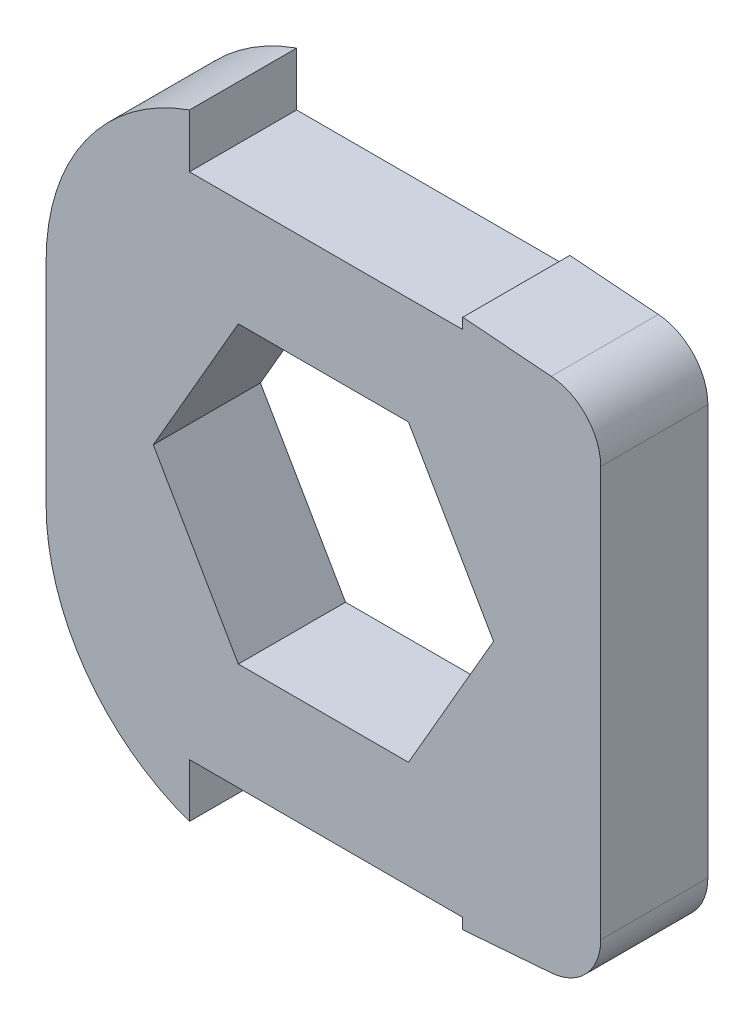
ISO-10303-21;
HEADER;
FILE_DESCRIPTION(('STEP AP214'),'2;1');
FILE_NAME('part.step','',(''),(''),'','','');
FILE_SCHEMA(('AUTOMOTIVE_DESIGN { 1 0 10303 214 1 1 1 1 }'));
ENDSEC;
DATA;
#1=APPLICATION_CONTEXT('core data for automotive mechanical design processes');
#2=APPLICATION_PROTOCOL_DEFINITION('international standard','automotive_design',2000,#1);
#3=PRODUCT_CONTEXT('',#1,'mechanical');
#4=PRODUCT('Part','Part','',(#3));
#5=PRODUCT_RELATED_PRODUCT_CATEGORY('part','',(#4));
#6=PRODUCT_DEFINITION_FORMATION('','',#4);
#7=PRODUCT_DEFINITION_CONTEXT('part definition',#1,'design');
#8=PRODUCT_DEFINITION('design','',#6,#7);
#9=PRODUCT_DEFINITION_SHAPE('','',#8);
#10=(LENGTH_UNIT() NAMED_UNIT(*) SI_UNIT(.MILLI.,.METRE.));
#11=(NAMED_UNIT(*) PLANE_ANGLE_UNIT() SI_UNIT($,.RADIAN.));
#12=(NAMED_UNIT(*) SI_UNIT($,.STERADIAN.) SOLID_ANGLE_UNIT());
#13=UNCERTAINTY_MEASURE_WITH_UNIT(LENGTH_MEASURE(1.E-05),#10,'distance_accuracy_value','');
#14=(GEOMETRIC_REPRESENTATION_CONTEXT(3) GLOBAL_UNCERTAINTY_ASSIGNED_CONTEXT((#13)) GLOBAL_UNIT_ASSIGNED_CONTEXT((#10,
#11,#12)) REPRESENTATION_CONTEXT('',''));
#15=CARTESIAN_POINT('',(0.,0.,0.));
#16=DIRECTION('',(0.,0.,1.));
#17=DIRECTION('',(1.,0.,0.));
#18=AXIS2_PLACEMENT_3D('',#15,#16,#17);
#19=CARTESIAN_POINT('',(0.,0.,2.));
#20=DIRECTION('',(0.,0.,-1.));
#21=DIRECTION('',(-1.,0.,0.));
#22=AXIS2_PLACEMENT_3D('',#19,#20,#21);
#23=PLANE('',#22);
#24=DIRECTION('',(0.996998261930065,0.0774239349841494,0.));
#25=VECTOR('',#24,1.);
#26=CARTESIAN_POINT('',(10.3508529610859,-4.75,2.));
#27=LINE('',#26,#25);
#28=CARTESIAN_POINT('',(7.77542648054295,-4.95,2.));
#29=VERTEX_POINT('',#28);
#30=CARTESIAN_POINT('',(9.42827689607004,-4.82164452738106,2.));
#31=VERTEX_POINT('',#30);
#32=EDGE_CURVE('E269',#29,#31,#27,.T.);
#33=ORIENTED_EDGE('',*,*,#32,.T.);
#34=CARTESIAN_POINT('',(9.35085296108589,-3.824646265451,2.));
#35=DIRECTION('',(0.,0.,-1.));
#36=DIRECTION('',(-1.,0.,0.));
#37=AXIS2_PLACEMENT_3D('',#34,#35,#36);
#38=CIRCLE('',#37,1.);
#39=CARTESIAN_POINT('',(10.3508529610859,-3.824646265451,2.));
#40=VERTEX_POINT('',#39);
#41=EDGE_CURVE('E48',#31,#40,#38,.F.);
#42=ORIENTED_EDGE('',*,*,#41,.T.);
#43=DIRECTION('',(0.,1.,0.));
#44=VECTOR('',#43,1.);
#45=CARTESIAN_POINT('',(10.3508529610859,4.75,2.));
#46=LINE('',#45,#44);
#47=CARTESIAN_POINT('',(10.3508529610859,3.824646265451,2.));
#48=VERTEX_POINT('',#47);
#49=EDGE_CURVE('E272',#40,#48,#46,.T.);
#50=ORIENTED_EDGE('',*,*,#49,.T.);
#51=CARTESIAN_POINT('',(9.35085296108589,3.824646265451,2.));
#52=DIRECTION('',(0.,0.,-1.));
#53=DIRECTION('',(-1.,0.,0.));
#54=AXIS2_PLACEMENT_3D('',#51,#52,#53);
#55=CIRCLE('',#54,1.);
#56=CARTESIAN_POINT('',(9.42827689607004,4.82164452738106,2.));
#57=VERTEX_POINT('',#56);
#58=EDGE_CURVE('E55',#48,#57,#55,.F.);
#59=ORIENTED_EDGE('',*,*,#58,.T.);
#60=DIRECTION('',(-0.996998261930065,0.0774239349841494,0.));
#61=VECTOR('',#60,1.);
#62=CARTESIAN_POINT('',(10.3508529610859,4.75,2.));
#63=LINE('',#62,#61);
#64=CARTESIAN_POINT('',(7.77542648054295,4.95,2.));
#65=VERTEX_POINT('',#64);
#66=EDGE_CURVE('E275',#57,#65,#63,.T.);
#67=ORIENTED_EDGE('',*,*,#66,.T.);
#68=DIRECTION('',(0.,-1.,0.));
#69=VECTOR('',#68,1.);
#70=CARTESIAN_POINT('',(7.77542648054295,4.95,2.));
#71=LINE('',#70,#69);
#72=CARTESIAN_POINT('',(7.77542648054295,4.75,2.));
#73=VERTEX_POINT('',#72);
#74=EDGE_CURVE('E278',#65,#73,#71,.T.);
#75=ORIENTED_EDGE('',*,*,#74,.T.);
#76=DIRECTION('',(-1.,0.,0.));
#77=VECTOR('',#76,1.);
#78=CARTESIAN_POINT('',(7.77542648054295,4.75,2.));
#79=LINE('',#78,#77);
#80=CARTESIAN_POINT('',(2.67542648054295,4.75,2.));
#81=VERTEX_POINT('',#80);
#82=EDGE_CURVE('E281',#73,#81,#79,.T.);
#83=ORIENTED_EDGE('',*,*,#82,.T.);
#84=DIRECTION('',(0.,1.,0.));
#85=VECTOR('',#84,1.);
#86=CARTESIAN_POINT('',(2.67542648054295,5.75,2.));
#87=LINE('',#86,#85);
#88=CARTESIAN_POINT('',(2.67542648054295,5.75,2.));
#89=VERTEX_POINT('',#88);
#90=EDGE_CURVE('E284',#81,#89,#87,.T.);
#91=ORIENTED_EDGE('',*,*,#90,.T.);
#92=CARTESIAN_POINT('',(4.,1.97567820773677,2.));
#93=DIRECTION('',(0.,0.,-1.));
#94=DIRECTION('',(-1.,0.,0.));
#95=AXIS2_PLACEMENT_3D('',#92,#93,#94);
#96=CIRCLE('',#95,4.);
#97=CARTESIAN_POINT('',(0.,1.97567820773677,2.));
#98=VERTEX_POINT('',#97);
#99=EDGE_CURVE('E363',#89,#98,#96,.F.);
#100=ORIENTED_EDGE('',*,*,#99,.T.);
#101=DIRECTION('',(0.,-1.,0.));
#102=VECTOR('',#101,1.);
#103=CARTESIAN_POINT('',(0.,-5.75,2.));
#104=LINE('',#103,#102);
#105=CARTESIAN_POINT('',(0.,-1.97567820773677,2.));
#106=VERTEX_POINT('',#105);
#107=EDGE_CURVE('E255',#98,#106,#104,.T.);
#108=ORIENTED_EDGE('',*,*,#107,.T.);
#109=CARTESIAN_POINT('',(4.,-1.97567820773677,2.));
#110=DIRECTION('',(0.,0.,-1.));
#111=DIRECTION('',(-1.,0.,0.));
#112=AXIS2_PLACEMENT_3D('',#109,#110,#111);
#113=CIRCLE('',#112,4.);
#114=CARTESIAN_POINT('',(2.67542648054295,-5.75,2.));
#115=VERTEX_POINT('',#114);
#116=EDGE_CURVE('E366',#106,#115,#113,.F.);
#117=ORIENTED_EDGE('',*,*,#116,.T.);
#118=DIRECTION('',(0.,1.,0.));
#119=VECTOR('',#118,1.);
#120=CARTESIAN_POINT('',(2.67542648054295,-4.75,2.));
#121=LINE('',#120,#119);
#122=CARTESIAN_POINT('',(2.67542648054295,-4.75,2.));
#123=VERTEX_POINT('',#122);
#124=EDGE_CURVE('E259',#115,#123,#121,.T.);
#125=ORIENTED_EDGE('',*,*,#124,.T.);
#126=DIRECTION('',(1.,0.,0.));
#127=VECTOR('',#126,1.);
#128=CARTESIAN_POINT('',(7.77542648054295,-4.75,2.));
#129=LINE('',#128,#127);
#130=CARTESIAN_POINT('',(7.77542648054295,-4.75,2.));
#131=VERTEX_POINT('',#130);
#132=EDGE_CURVE('E263',#123,#131,#129,.T.);
#133=ORIENTED_EDGE('',*,*,#132,.T.);
#134=DIRECTION('',(0.,-1.,0.));
#135=VECTOR('',#134,1.);
#136=CARTESIAN_POINT('',(7.77542648054295,-4.95,2.));
#137=LINE('',#136,#135);
#138=EDGE_CURVE('E266',#131,#29,#137,.T.);
#139=ORIENTED_EDGE('',*,*,#138,.T.);
#140=EDGE_LOOP('',(#33,#42,#50,#59,#67,#75,#83,#91,#100,#108,#117,#125,#133,#139));
#141=FACE_BOUND('',#140,.T.);
#142=DIRECTION('',(-0.5,-0.866025403784438,0.));
#143=VECTOR('',#142,1.);
#144=CARTESIAN_POINT('',(3.58771324027147,2.75,2.));
#145=LINE('',#144,#143);
#146=CARTESIAN_POINT('',(3.58771324027147,2.75,2.));
#147=VERTEX_POINT('',#146);
#148=CARTESIAN_POINT('',(2.,0.,2.));
#149=VERTEX_POINT('',#148);
#150=EDGE_CURVE('E181',#147,#149,#145,.T.);
#151=ORIENTED_EDGE('',*,*,#150,.F.);
#152=DIRECTION('',(-1.,0.,0.));
#153=VECTOR('',#152,1.);
#154=CARTESIAN_POINT('',(6.76313972081442,2.75,2.));
#155=LINE('',#154,#153);
#156=CARTESIAN_POINT('',(6.76313972081442,2.75,2.));
#157=VERTEX_POINT('',#156);
#158=EDGE_CURVE('E219',#157,#147,#155,.T.);
#159=ORIENTED_EDGE('',*,*,#158,.F.);
#160=DIRECTION('',(-0.5,0.866025403784438,0.));
#161=VECTOR('',#160,1.);
#162=CARTESIAN_POINT('',(8.35085296108589,0.,2.));
#163=LINE('',#162,#161);
#164=CARTESIAN_POINT('',(8.35085296108589,0.,2.));
#165=VERTEX_POINT('',#164);
#166=EDGE_CURVE('E215',#165,#157,#163,.T.);
#167=ORIENTED_EDGE('',*,*,#166,.F.);
#168=DIRECTION('',(0.5,0.866025403784439,0.));
#169=VECTOR('',#168,1.);
#170=CARTESIAN_POINT('',(6.76313972081442,-2.75,2.));
#171=LINE('',#170,#169);
#172=CARTESIAN_POINT('',(6.76313972081442,-2.75,2.));
#173=VERTEX_POINT('',#172);
#174=EDGE_CURVE('E210',#173,#165,#171,.T.);
#175=ORIENTED_EDGE('',*,*,#174,.F.);
#176=DIRECTION('',(1.,0.,0.));
#177=VECTOR('',#176,1.);
#178=CARTESIAN_POINT('',(3.58771324027147,-2.75,2.));
#179=LINE('',#178,#177);
#180=CARTESIAN_POINT('',(3.58771324027147,-2.75,2.));
#181=VERTEX_POINT('',#180);
#182=EDGE_CURVE('E206',#181,#173,#179,.T.);
#183=ORIENTED_EDGE('',*,*,#182,.F.);
#184=DIRECTION('',(0.500000000000002,-0.866025403784438,0.));
#185=VECTOR('',#184,1.);
#186=CARTESIAN_POINT('',(2.,0.,2.));
#187=LINE('',#186,#185);
#188=EDGE_CURVE('E192',#149,#181,#187,.T.);
#189=ORIENTED_EDGE('',*,*,#188,.F.);
#190=EDGE_LOOP('',(#151,#159,#167,#175,#183,#189));
#191=FACE_BOUND('',#190,.T.);
#192=ADVANCED_FACE('F39',(#141,#191),#23,.F.);
#193=CARTESIAN_POINT('',(0.,0.,0.));
#194=DIRECTION('',(0.,0.,-1.));
#195=DIRECTION('',(-1.,0.,0.));
#196=AXIS2_PLACEMENT_3D('',#193,#194,#195);
#197=PLANE('',#196);
#198=DIRECTION('',(0.,1.,0.));
#199=VECTOR('',#198,1.);
#200=CARTESIAN_POINT('',(10.3508529610859,4.75,0.));
#201=LINE('',#200,#199);
#202=CARTESIAN_POINT('',(10.3508529610859,-3.824646265451,0.));
#203=VERTEX_POINT('',#202);
#204=CARTESIAN_POINT('',(10.3508529610859,3.824646265451,0.));
#205=VERTEX_POINT('',#204);
#206=EDGE_CURVE('E303',#203,#205,#201,.T.);
#207=ORIENTED_EDGE('',*,*,#206,.F.);
#208=CARTESIAN_POINT('',(9.35085296108589,-3.824646265451,0.));
#209=DIRECTION('',(0.,0.,-1.));
#210=DIRECTION('',(-1.,0.,0.));
#211=AXIS2_PLACEMENT_3D('',#208,#209,#210);
#212=CIRCLE('',#211,1.);
#213=CARTESIAN_POINT('',(9.42827689607004,-4.82164452738106,0.));
#214=VERTEX_POINT('',#213);
#215=EDGE_CURVE('E379',#203,#214,#212,.T.);
#216=ORIENTED_EDGE('',*,*,#215,.T.);
#217=DIRECTION('',(0.996998261930065,0.0774239349841494,0.));
#218=VECTOR('',#217,1.);
#219=CARTESIAN_POINT('',(10.3508529610859,-4.75,0.));
#220=LINE('',#219,#218);
#221=CARTESIAN_POINT('',(7.77542648054295,-4.95,0.));
#222=VERTEX_POINT('',#221);
#223=EDGE_CURVE('E300',#222,#214,#220,.T.);
#224=ORIENTED_EDGE('',*,*,#223,.F.);
#225=DIRECTION('',(0.,-1.,0.));
#226=VECTOR('',#225,1.);
#227=CARTESIAN_POINT('',(7.77542648054295,-4.95,0.));
#228=LINE('',#227,#226);
#229=CARTESIAN_POINT('',(7.77542648054295,-4.75,0.));
#230=VERTEX_POINT('',#229);
#231=EDGE_CURVE('E297',#230,#222,#228,.T.);
#232=ORIENTED_EDGE('',*,*,#231,.F.);
#233=DIRECTION('',(1.,0.,0.));
#234=VECTOR('',#233,1.);
#235=CARTESIAN_POINT('',(7.77542648054295,-4.75,0.));
#236=LINE('',#235,#234);
#237=CARTESIAN_POINT('',(2.67542648054295,-4.75,0.));
#238=VERTEX_POINT('',#237);
#239=EDGE_CURVE('E294',#238,#230,#236,.T.);
#240=ORIENTED_EDGE('',*,*,#239,.F.);
#241=DIRECTION('',(0.,1.,0.));
#242=VECTOR('',#241,1.);
#243=CARTESIAN_POINT('',(2.67542648054295,-4.75,0.));
#244=LINE('',#243,#242);
#245=CARTESIAN_POINT('',(2.67542648054295,-5.75,0.));
#246=VERTEX_POINT('',#245);
#247=EDGE_CURVE('E291',#246,#238,#244,.T.);
#248=ORIENTED_EDGE('',*,*,#247,.F.);
#249=CARTESIAN_POINT('',(4.,-1.97567820773677,0.));
#250=DIRECTION('',(0.,0.,-1.));
#251=DIRECTION('',(-1.,0.,0.));
#252=AXIS2_PLACEMENT_3D('',#249,#250,#251);
#253=CIRCLE('',#252,4.);
#254=CARTESIAN_POINT('',(0.,-1.97567820773677,0.));
#255=VERTEX_POINT('',#254);
#256=EDGE_CURVE('E353',#246,#255,#253,.T.);
#257=ORIENTED_EDGE('',*,*,#256,.T.);
#258=DIRECTION('',(0.,-1.,0.));
#259=VECTOR('',#258,1.);
#260=CARTESIAN_POINT('',(0.,-5.75,0.));
#261=LINE('',#260,#259);
#262=CARTESIAN_POINT('',(0.,1.97567820773677,0.));
#263=VERTEX_POINT('',#262);
#264=EDGE_CURVE('E201',#263,#255,#261,.T.);
#265=ORIENTED_EDGE('',*,*,#264,.F.);
#266=CARTESIAN_POINT('',(4.,1.97567820773677,0.));
#267=DIRECTION('',(0.,0.,-1.));
#268=DIRECTION('',(-1.,0.,0.));
#269=AXIS2_PLACEMENT_3D('',#266,#267,#268);
#270=CIRCLE('',#269,4.);
#271=CARTESIAN_POINT('',(2.67542648054295,5.75,0.));
#272=VERTEX_POINT('',#271);
#273=EDGE_CURVE('E350',#263,#272,#270,.T.);
#274=ORIENTED_EDGE('',*,*,#273,.T.);
#275=DIRECTION('',(0.,1.,0.));
#276=VECTOR('',#275,1.);
#277=CARTESIAN_POINT('',(2.67542648054295,5.75,0.));
#278=LINE('',#277,#276);
#279=CARTESIAN_POINT('',(2.67542648054295,4.75,0.));
#280=VERTEX_POINT('',#279);
#281=EDGE_CURVE('E260',#280,#272,#278,.T.);
#282=ORIENTED_EDGE('',*,*,#281,.F.);
#283=DIRECTION('',(-1.,0.,0.));
#284=VECTOR('',#283,1.);
#285=CARTESIAN_POINT('',(7.77542648054295,4.75,0.));
#286=LINE('',#285,#284);
#287=CARTESIAN_POINT('',(7.77542648054295,4.75,0.));
#288=VERTEX_POINT('',#287);
#289=EDGE_CURVE('E313',#288,#280,#286,.T.);
#290=ORIENTED_EDGE('',*,*,#289,.F.);
#291=DIRECTION('',(0.,-1.,0.));
#292=VECTOR('',#291,1.);
#293=CARTESIAN_POINT('',(7.77542648054295,4.95,0.));
#294=LINE('',#293,#292);
#295=CARTESIAN_POINT('',(7.77542648054295,4.95,0.));
#296=VERTEX_POINT('',#295);
#297=EDGE_CURVE('E310',#296,#288,#294,.T.);
#298=ORIENTED_EDGE('',*,*,#297,.F.);
#299=DIRECTION('',(-0.996998261930065,0.0774239349841494,0.));
#300=VECTOR('',#299,1.);
#301=CARTESIAN_POINT('',(10.3508529610859,4.75,0.));
#302=LINE('',#301,#300);
#303=CARTESIAN_POINT('',(9.42827689607004,4.82164452738106,0.));
#304=VERTEX_POINT('',#303);
#305=EDGE_CURVE('E307',#304,#296,#302,.T.);
#306=ORIENTED_EDGE('',*,*,#305,.F.);
#307=CARTESIAN_POINT('',(9.35085296108589,3.824646265451,0.));
#308=DIRECTION('',(0.,0.,-1.));
#309=DIRECTION('',(-1.,0.,0.));
#310=AXIS2_PLACEMENT_3D('',#307,#308,#309);
#311=CIRCLE('',#310,1.);
#312=EDGE_CURVE('E376',#304,#205,#311,.T.);
#313=ORIENTED_EDGE('',*,*,#312,.T.);
#314=EDGE_LOOP('',(#207,#216,#224,#232,#240,#248,#257,#265,#274,#282,#290,#298,#306,#313));
#315=FACE_BOUND('',#314,.T.);
#316=DIRECTION('',(-1.,0.,0.));
#317=VECTOR('',#316,1.);
#318=CARTESIAN_POINT('',(6.76313972081442,2.75,0.));
#319=LINE('',#318,#317);
#320=CARTESIAN_POINT('',(6.76313972081442,2.75,0.));
#321=VERTEX_POINT('',#320);
#322=CARTESIAN_POINT('',(3.58771324027147,2.75,0.));
#323=VERTEX_POINT('',#322);
#324=EDGE_CURVE('E193',#321,#323,#319,.T.);
#325=ORIENTED_EDGE('',*,*,#324,.T.);
#326=DIRECTION('',(-0.5,-0.866025403784438,0.));
#327=VECTOR('',#326,1.);
#328=CARTESIAN_POINT('',(3.58771324027147,2.75,0.));
#329=LINE('',#328,#327);
#330=CARTESIAN_POINT('',(2.,0.,0.));
#331=VERTEX_POINT('',#330);
#332=EDGE_CURVE('E222',#323,#331,#329,.T.);
#333=ORIENTED_EDGE('',*,*,#332,.T.);
#334=DIRECTION('',(0.500000000000002,-0.866025403784438,0.));
#335=VECTOR('',#334,1.);
#336=CARTESIAN_POINT('',(2.,0.,0.));
#337=LINE('',#336,#335);
#338=CARTESIAN_POINT('',(3.58771324027147,-2.75,0.));
#339=VERTEX_POINT('',#338);
#340=EDGE_CURVE('E199',#331,#339,#337,.T.);
#341=ORIENTED_EDGE('',*,*,#340,.T.);
#342=DIRECTION('',(1.,0.,0.));
#343=VECTOR('',#342,1.);
#344=CARTESIAN_POINT('',(3.58771324027147,-2.75,0.));
#345=LINE('',#344,#343);
#346=CARTESIAN_POINT('',(6.76313972081442,-2.75,0.));
#347=VERTEX_POINT('',#346);
#348=EDGE_CURVE('E227',#339,#347,#345,.T.);
#349=ORIENTED_EDGE('',*,*,#348,.T.);
#350=DIRECTION('',(0.5,0.866025403784439,0.));
#351=VECTOR('',#350,1.);
#352=CARTESIAN_POINT('',(6.76313972081442,-2.75,0.));
#353=LINE('',#352,#351);
#354=CARTESIAN_POINT('',(8.35085296108589,0.,0.));
#355=VERTEX_POINT('',#354);
#356=EDGE_CURVE('E231',#347,#355,#353,.T.);
#357=ORIENTED_EDGE('',*,*,#356,.T.);
#358=DIRECTION('',(-0.5,0.866025403784438,0.));
#359=VECTOR('',#358,1.);
#360=CARTESIAN_POINT('',(8.35085296108589,0.,0.));
#361=LINE('',#360,#359);
#362=EDGE_CURVE('E235',#355,#321,#361,.T.);
#363=ORIENTED_EDGE('',*,*,#362,.T.);
#364=EDGE_LOOP('',(#325,#333,#341,#349,#357,#363));
#365=FACE_BOUND('',#364,.T.);
#366=ADVANCED_FACE('F397',(#315,#365),#197,.T.);
#367=CARTESIAN_POINT('',(0.,-5.75,2.));
#368=DIRECTION('',(1.,0.,0.));
#369=DIRECTION('',(0.,0.,-1.));
#370=AXIS2_PLACEMENT_3D('',#367,#368,#369);
#371=PLANE('',#370);
#372=ORIENTED_EDGE('',*,*,#264,.T.);
#373=DIRECTION('',(0.,0.,1.));
#374=VECTOR('',#373,1.);
#375=CARTESIAN_POINT('',(0.,-1.97567820773677,2.));
#376=LINE('',#375,#374);
#377=EDGE_CURVE('E360',#255,#106,#376,.T.);
#378=ORIENTED_EDGE('',*,*,#377,.T.);
#379=ORIENTED_EDGE('',*,*,#107,.F.);
#380=DIRECTION('',(0.,0.,-1.));
#381=VECTOR('',#380,1.);
#382=CARTESIAN_POINT('',(0.,1.97567820773677,2.));
#383=LINE('',#382,#381);
#384=EDGE_CURVE('E356',#98,#263,#383,.T.);
#385=ORIENTED_EDGE('',*,*,#384,.T.);
#386=EDGE_LOOP('',(#372,#378,#379,#385));
#387=FACE_BOUND('',#386,.T.);
#388=ADVANCED_FACE('F422',(#387),#371,.F.);
#389=CARTESIAN_POINT('',(2.67542648054295,-4.75,2.));
#390=DIRECTION('',(-1.,0.,0.));
#391=DIRECTION('',(0.,0.,1.));
#392=AXIS2_PLACEMENT_3D('',#389,#390,#391);
#393=PLANE('',#392);
#394=ORIENTED_EDGE('',*,*,#247,.T.);
#395=DIRECTION('',(0.,0.,-1.));
#396=VECTOR('',#395,1.);
#397=CARTESIAN_POINT('',(2.67542648054295,-4.75,2.));
#398=LINE('',#397,#396);
#399=EDGE_CURVE('E342',#123,#238,#398,.T.);
#400=ORIENTED_EDGE('',*,*,#399,.F.);
#401=ORIENTED_EDGE('',*,*,#124,.F.);
#402=DIRECTION('',(0.,0.,-1.));
#403=VECTOR('',#402,1.);
#404=CARTESIAN_POINT('',(2.67542648054295,-5.75,2.));
#405=LINE('',#404,#403);
#406=EDGE_CURVE('E346',#115,#246,#405,.T.);
#407=ORIENTED_EDGE('',*,*,#406,.T.);
#408=EDGE_LOOP('',(#394,#400,#401,#407));
#409=FACE_BOUND('',#408,.T.);
#410=ADVANCED_FACE('F414',(#409),#393,.F.);
#411=CARTESIAN_POINT('',(7.77542648054295,-4.75,2.));
#412=DIRECTION('',(0.,1.,0.));
#413=DIRECTION('',(0.,0.,1.));
#414=AXIS2_PLACEMENT_3D('',#411,#412,#413);
#415=PLANE('',#414);
#416=ORIENTED_EDGE('',*,*,#239,.T.);
#417=DIRECTION('',(0.,0.,-1.));
#418=VECTOR('',#417,1.);
#419=CARTESIAN_POINT('',(7.77542648054295,-4.75,2.));
#420=LINE('',#419,#418);
#421=EDGE_CURVE('E338',#131,#230,#420,.T.);
#422=ORIENTED_EDGE('',*,*,#421,.F.);
#423=ORIENTED_EDGE('',*,*,#132,.F.);
#424=ORIENTED_EDGE('',*,*,#399,.T.);
#425=EDGE_LOOP('',(#416,#422,#423,#424));
#426=FACE_BOUND('',#425,.T.);
#427=ADVANCED_FACE('F409',(#426),#415,.F.);
#428=CARTESIAN_POINT('',(7.77542648054295,-4.95,2.));
#429=DIRECTION('',(1.,0.,0.));
#430=DIRECTION('',(0.,1.,0.));
#431=AXIS2_PLACEMENT_3D('',#428,#429,#430);
#432=PLANE('',#431);
#433=ORIENTED_EDGE('',*,*,#231,.T.);
#434=DIRECTION('',(0.,0.,-1.));
#435=VECTOR('',#434,1.);
#436=CARTESIAN_POINT('',(7.77542648054295,-4.95,2.));
#437=LINE('',#436,#435);
#438=EDGE_CURVE('E334',#29,#222,#437,.T.);
#439=ORIENTED_EDGE('',*,*,#438,.F.);
#440=ORIENTED_EDGE('',*,*,#138,.F.);
#441=ORIENTED_EDGE('',*,*,#421,.T.);
#442=EDGE_LOOP('',(#433,#439,#440,#441));
#443=FACE_BOUND('',#442,.T.);
#444=ADVANCED_FACE('F404',(#443),#432,.F.);
#445=CARTESIAN_POINT('',(10.3508529610859,-4.75,2.));
#446=DIRECTION('',(-0.0774239349841495,0.996998261930065,0.));
#447=DIRECTION('',(-0.996998261930065,-0.0774239349841495,0.));
#448=AXIS2_PLACEMENT_3D('',#445,#446,#447);
#449=PLANE('',#448);
#450=ORIENTED_EDGE('',*,*,#223,.T.);
#451=DIRECTION('',(0.,0.,-1.));
#452=VECTOR('',#451,1.);
#453=CARTESIAN_POINT('',(9.42827689607004,-4.82164452738106,2.));
#454=LINE('',#453,#452);
#455=EDGE_CURVE('E63',#214,#31,#454,.F.);
#456=ORIENTED_EDGE('',*,*,#455,.T.);
#457=ORIENTED_EDGE('',*,*,#32,.F.);
#458=ORIENTED_EDGE('',*,*,#438,.T.);
#459=EDGE_LOOP('',(#450,#456,#457,#458));
#460=FACE_BOUND('',#459,.T.);
#461=ADVANCED_FACE('F400',(#460),#449,.F.);
#462=CARTESIAN_POINT('',(10.3508529610859,4.75,2.));
#463=DIRECTION('',(-1.,0.,0.));
#464=DIRECTION('',(0.,0.,1.));
#465=AXIS2_PLACEMENT_3D('',#462,#463,#464);
#466=PLANE('',#465);
#467=ORIENTED_EDGE('',*,*,#49,.F.);
#468=DIRECTION('',(0.,0.,-1.));
#469=VECTOR('',#468,1.);
#470=CARTESIAN_POINT('',(10.3508529610859,-3.824646265451,2.));
#471=LINE('',#470,#469);
#472=EDGE_CURVE('E372',#40,#203,#471,.T.);
#473=ORIENTED_EDGE('',*,*,#472,.T.);
#474=ORIENTED_EDGE('',*,*,#206,.T.);
#475=DIRECTION('',(0.,0.,-1.));
#476=VECTOR('',#475,1.);
#477=CARTESIAN_POINT('',(10.3508529610859,3.824646265451,2.));
#478=LINE('',#477,#476);
#479=EDGE_CURVE('E369',#205,#48,#478,.F.);
#480=ORIENTED_EDGE('',*,*,#479,.T.);
#481=EDGE_LOOP('',(#467,#473,#474,#480));
#482=FACE_BOUND('',#481,.T.);
#483=ADVANCED_FACE('F391',(#482),#466,.F.);
#484=CARTESIAN_POINT('',(10.3508529610859,4.75,2.));
#485=DIRECTION('',(-0.0774239349841495,-0.996998261930065,0.));
#486=DIRECTION('',(0.996998261930065,-0.0774239349841495,0.));
#487=AXIS2_PLACEMENT_3D('',#484,#485,#486);
#488=PLANE('',#487);
#489=ORIENTED_EDGE('',*,*,#66,.F.);
#490=DIRECTION('',(0.,0.,-1.));
#491=VECTOR('',#490,1.);
#492=CARTESIAN_POINT('',(9.42827689607004,4.82164452738106,2.));
#493=LINE('',#492,#491);
#494=EDGE_CURVE('E11',#57,#304,#493,.T.);
#495=ORIENTED_EDGE('',*,*,#494,.T.);
#496=ORIENTED_EDGE('',*,*,#305,.T.);
#497=DIRECTION('',(0.,0.,-1.));
#498=VECTOR('',#497,1.);
#499=CARTESIAN_POINT('',(7.77542648054295,4.95,2.));
#500=LINE('',#499,#498);
#501=EDGE_CURVE('E330',#65,#296,#500,.T.);
#502=ORIENTED_EDGE('',*,*,#501,.F.);
#503=EDGE_LOOP('',(#489,#495,#496,#502));
#504=FACE_BOUND('',#503,.T.);
#505=ADVANCED_FACE('F446',(#504),#488,.F.);
#506=CARTESIAN_POINT('',(7.77542648054295,4.95,2.));
#507=DIRECTION('',(1.,0.,0.));
#508=DIRECTION('',(0.,1.,0.));
#509=AXIS2_PLACEMENT_3D('',#506,#507,#508);
#510=PLANE('',#509);
#511=ORIENTED_EDGE('',*,*,#297,.T.);
#512=DIRECTION('',(0.,0.,-1.));
#513=VECTOR('',#512,1.);
#514=CARTESIAN_POINT('',(7.77542648054295,4.75,2.));
#515=LINE('',#514,#513);
#516=EDGE_CURVE('E326',#73,#288,#515,.T.);
#517=ORIENTED_EDGE('',*,*,#516,.F.);
#518=ORIENTED_EDGE('',*,*,#74,.F.);
#519=ORIENTED_EDGE('',*,*,#501,.T.);
#520=EDGE_LOOP('',(#511,#517,#518,#519));
#521=FACE_BOUND('',#520,.T.);
#522=ADVANCED_FACE('F442',(#521),#510,.F.);
#523=CARTESIAN_POINT('',(7.77542648054295,4.75,2.));
#524=DIRECTION('',(0.,-1.,0.));
#525=DIRECTION('',(0.,0.,-1.));
#526=AXIS2_PLACEMENT_3D('',#523,#524,#525);
#527=PLANE('',#526);
#528=ORIENTED_EDGE('',*,*,#289,.T.);
#529=DIRECTION('',(0.,0.,-1.));
#530=VECTOR('',#529,1.);
#531=CARTESIAN_POINT('',(2.67542648054295,4.75,2.));
#532=LINE('',#531,#530);
#533=EDGE_CURVE('E322',#81,#280,#532,.T.);
#534=ORIENTED_EDGE('',*,*,#533,.F.);
#535=ORIENTED_EDGE('',*,*,#82,.F.);
#536=ORIENTED_EDGE('',*,*,#516,.T.);
#537=EDGE_LOOP('',(#528,#534,#535,#536));
#538=FACE_BOUND('',#537,.T.);
#539=ADVANCED_FACE('F437',(#538),#527,.F.);
#540=CARTESIAN_POINT('',(2.67542648054295,5.75,2.));
#541=DIRECTION('',(-1.,0.,0.));
#542=DIRECTION('',(0.,0.,1.));
#543=AXIS2_PLACEMENT_3D('',#540,#541,#542);
#544=PLANE('',#543);
#545=ORIENTED_EDGE('',*,*,#281,.T.);
#546=DIRECTION('',(0.,0.,-1.));
#547=VECTOR('',#546,1.);
#548=CARTESIAN_POINT('',(2.67542648054295,5.75,2.));
#549=LINE('',#548,#547);
#550=EDGE_CURVE('E287',#89,#272,#549,.T.);
#551=ORIENTED_EDGE('',*,*,#550,.F.);
#552=ORIENTED_EDGE('',*,*,#90,.F.);
#553=ORIENTED_EDGE('',*,*,#533,.T.);
#554=EDGE_LOOP('',(#545,#551,#552,#553));
#555=FACE_BOUND('',#554,.T.);
#556=ADVANCED_FACE('F432',(#555),#544,.F.);
#557=CARTESIAN_POINT('',(3.58771324027147,2.75,2.));
#558=DIRECTION('',(0.866025403784439,-0.5,0.));
#559=DIRECTION('',(0.5,0.866025403784438,0.));
#560=AXIS2_PLACEMENT_3D('',#557,#558,#559);
#561=PLANE('',#560);
#562=ORIENTED_EDGE('',*,*,#332,.F.);
#563=DIRECTION('',(0.,0.,-1.));
#564=VECTOR('',#563,1.);
#565=CARTESIAN_POINT('',(3.58771324027147,2.75,2.));
#566=LINE('',#565,#564);
#567=EDGE_CURVE('E187',#147,#323,#566,.T.);
#568=ORIENTED_EDGE('',*,*,#567,.F.);
#569=ORIENTED_EDGE('',*,*,#150,.T.);
#570=DIRECTION('',(0.,0.,-1.));
#571=VECTOR('',#570,1.);
#572=CARTESIAN_POINT('',(2.,0.,2.));
#573=LINE('',#572,#571);
#574=EDGE_CURVE('E184',#149,#331,#573,.T.);
#575=ORIENTED_EDGE('',*,*,#574,.T.);
#576=EDGE_LOOP('',(#562,#568,#569,#575));
#577=FACE_BOUND('',#576,.T.);
#578=ADVANCED_FACE('F183',(#577),#561,.T.);
#579=CARTESIAN_POINT('',(2.,0.,2.));
#580=DIRECTION('',(0.866025403784438,0.500000000000002,0.));
#581=DIRECTION('',(-0.500000000000002,0.866025403784438,0.));
#582=AXIS2_PLACEMENT_3D('',#579,#580,#581);
#583=PLANE('',#582);
#584=ORIENTED_EDGE('',*,*,#340,.F.);
#585=ORIENTED_EDGE('',*,*,#574,.F.);
#586=ORIENTED_EDGE('',*,*,#188,.T.);
#587=DIRECTION('',(0.,0.,-1.));
#588=VECTOR('',#587,1.);
#589=CARTESIAN_POINT('',(3.58771324027147,-2.75,2.));
#590=LINE('',#589,#588);
#591=EDGE_CURVE('E202',#181,#339,#590,.T.);
#592=ORIENTED_EDGE('',*,*,#591,.T.);
#593=EDGE_LOOP('',(#584,#585,#586,#592));
#594=FACE_BOUND('',#593,.T.);
#595=ADVANCED_FACE('F196',(#594),#583,.T.);
#596=CARTESIAN_POINT('',(3.58771324027147,-2.75,2.));
#597=DIRECTION('',(0.,1.,0.));
#598=DIRECTION('',(0.,0.,1.));
#599=AXIS2_PLACEMENT_3D('',#596,#597,#598);
#600=PLANE('',#599);
#601=ORIENTED_EDGE('',*,*,#348,.F.);
#602=ORIENTED_EDGE('',*,*,#591,.F.);
#603=ORIENTED_EDGE('',*,*,#182,.T.);
#604=DIRECTION('',(0.,0.,-1.));
#605=VECTOR('',#604,1.);
#606=CARTESIAN_POINT('',(6.76313972081442,-2.75,2.));
#607=LINE('',#606,#605);
#608=EDGE_CURVE('E250',#173,#347,#607,.T.);
#609=ORIENTED_EDGE('',*,*,#608,.T.);
#610=EDGE_LOOP('',(#601,#602,#603,#609));
#611=FACE_BOUND('',#610,.T.);
#612=ADVANCED_FACE('F576',(#611),#600,.T.);
#613=CARTESIAN_POINT('',(6.76313972081442,-2.75,2.));
#614=DIRECTION('',(-0.866025403784439,0.5,0.));
#615=DIRECTION('',(-0.5,-0.866025403784439,0.));
#616=AXIS2_PLACEMENT_3D('',#613,#614,#615);
#617=PLANE('',#616);
#618=ORIENTED_EDGE('',*,*,#356,.F.);
#619=ORIENTED_EDGE('',*,*,#608,.F.);
#620=ORIENTED_EDGE('',*,*,#174,.T.);
#621=DIRECTION('',(0.,0.,-1.));
#622=VECTOR('',#621,1.);
#623=CARTESIAN_POINT('',(8.35085296108589,0.,2.));
#624=LINE('',#623,#622);
#625=EDGE_CURVE('E247',#165,#355,#624,.T.);
#626=ORIENTED_EDGE('',*,*,#625,.T.);
#627=EDGE_LOOP('',(#618,#619,#620,#626));
#628=FACE_BOUND('',#627,.T.);
#629=ADVANCED_FACE('F584',(#628),#617,.T.);
#630=CARTESIAN_POINT('',(8.35085296108589,0.,2.));
#631=DIRECTION('',(-0.866025403784439,-0.5,0.));
#632=DIRECTION('',(0.5,-0.866025403784438,0.));
#633=AXIS2_PLACEMENT_3D('',#630,#631,#632);
#634=PLANE('',#633);
#635=ORIENTED_EDGE('',*,*,#362,.F.);
#636=ORIENTED_EDGE('',*,*,#625,.F.);
#637=ORIENTED_EDGE('',*,*,#166,.T.);
#638=DIRECTION('',(0.,0.,-1.));
#639=VECTOR('',#638,1.);
#640=CARTESIAN_POINT('',(6.76313972081442,2.75,2.));
#641=LINE('',#640,#639);
#642=EDGE_CURVE('E244',#157,#321,#641,.T.);
#643=ORIENTED_EDGE('',*,*,#642,.T.);
#644=EDGE_LOOP('',(#635,#636,#637,#643));
#645=FACE_BOUND('',#644,.T.);
#646=ADVANCED_FACE('F594',(#645),#634,.T.);
#647=CARTESIAN_POINT('',(6.76313972081442,2.75,2.));
#648=DIRECTION('',(0.,-1.,0.));
#649=DIRECTION('',(1.,0.,0.));
#650=AXIS2_PLACEMENT_3D('',#647,#648,#649);
#651=PLANE('',#650);
#652=ORIENTED_EDGE('',*,*,#324,.F.);
#653=ORIENTED_EDGE('',*,*,#642,.F.);
#654=ORIENTED_EDGE('',*,*,#158,.T.);
#655=ORIENTED_EDGE('',*,*,#567,.T.);
#656=EDGE_LOOP('',(#652,#653,#654,#655));
#657=FACE_BOUND('',#656,.T.);
#658=ADVANCED_FACE('F484',(#657),#651,.T.);
#659=CARTESIAN_POINT('',(4.,-1.97567820773677,2.));
#660=DIRECTION('',(0.,0.,1.));
#661=DIRECTION('',(1.,0.,0.));
#662=AXIS2_PLACEMENT_3D('',#659,#660,#661);
#663=CYLINDRICAL_SURFACE('',#662,4.);
#664=ORIENTED_EDGE('',*,*,#116,.F.);
#665=ORIENTED_EDGE('',*,*,#377,.F.);
#666=ORIENTED_EDGE('',*,*,#256,.F.);
#667=ORIENTED_EDGE('',*,*,#406,.F.);
#668=EDGE_LOOP('',(#664,#665,#666,#667));
#669=FACE_BOUND('',#668,.T.);
#670=ADVANCED_FACE('F418',(#669),#663,.T.);
#671=CARTESIAN_POINT('',(4.,1.97567820773677,2.));
#672=DIRECTION('',(0.,0.,-1.));
#673=DIRECTION('',(-1.,0.,0.));
#674=AXIS2_PLACEMENT_3D('',#671,#672,#673);
#675=CYLINDRICAL_SURFACE('',#674,4.);
#676=ORIENTED_EDGE('',*,*,#99,.F.);
#677=ORIENTED_EDGE('',*,*,#550,.T.);
#678=ORIENTED_EDGE('',*,*,#273,.F.);
#679=ORIENTED_EDGE('',*,*,#384,.F.);
#680=EDGE_LOOP('',(#676,#677,#678,#679));
#681=FACE_BOUND('',#680,.T.);
#682=ADVANCED_FACE('F427',(#681),#675,.T.);
#683=CARTESIAN_POINT('',(9.35085296108589,-3.824646265451,2.));
#684=DIRECTION('',(0.,0.,-1.));
#685=DIRECTION('',(-1.,0.,0.));
#686=AXIS2_PLACEMENT_3D('',#683,#684,#685);
#687=CYLINDRICAL_SURFACE('',#686,1.);
#688=ORIENTED_EDGE('',*,*,#41,.F.);
#689=ORIENTED_EDGE('',*,*,#455,.F.);
#690=ORIENTED_EDGE('',*,*,#215,.F.);
#691=ORIENTED_EDGE('',*,*,#472,.F.);
#692=EDGE_LOOP('',(#688,#689,#690,#691));
#693=FACE_BOUND('',#692,.T.);
#694=ADVANCED_FACE('F394',(#693),#687,.T.);
#695=CARTESIAN_POINT('',(9.35085296108589,3.824646265451,2.));
#696=DIRECTION('',(0.,0.,-1.));
#697=DIRECTION('',(-1.,0.,0.));
#698=AXIS2_PLACEMENT_3D('',#695,#696,#697);
#699=CYLINDRICAL_SURFACE('',#698,1.);
#700=ORIENTED_EDGE('',*,*,#58,.F.);
#701=ORIENTED_EDGE('',*,*,#479,.F.);
#702=ORIENTED_EDGE('',*,*,#312,.F.);
#703=ORIENTED_EDGE('',*,*,#494,.F.);
#704=EDGE_LOOP('',(#700,#701,#702,#703));
#705=FACE_BOUND('',#704,.T.);
#706=ADVANCED_FACE('F41',(#705),#699,.T.);
#707=CLOSED_SHELL('',(#192,#366,#388,#410,#427,#444,#461,#483,#505,#522,#539,#556,#578,#595,
#612,#629,#646,#658,#670,#682,#694,#706));
#708=MANIFOLD_SOLID_BREP('B2',#707);
#709=ADVANCED_BREP_SHAPE_REPRESENTATION('',(#18,#708),#14);
#710=SHAPE_DEFINITION_REPRESENTATION(#9,#709);
ENDSEC;
END-ISO-10303-21;
